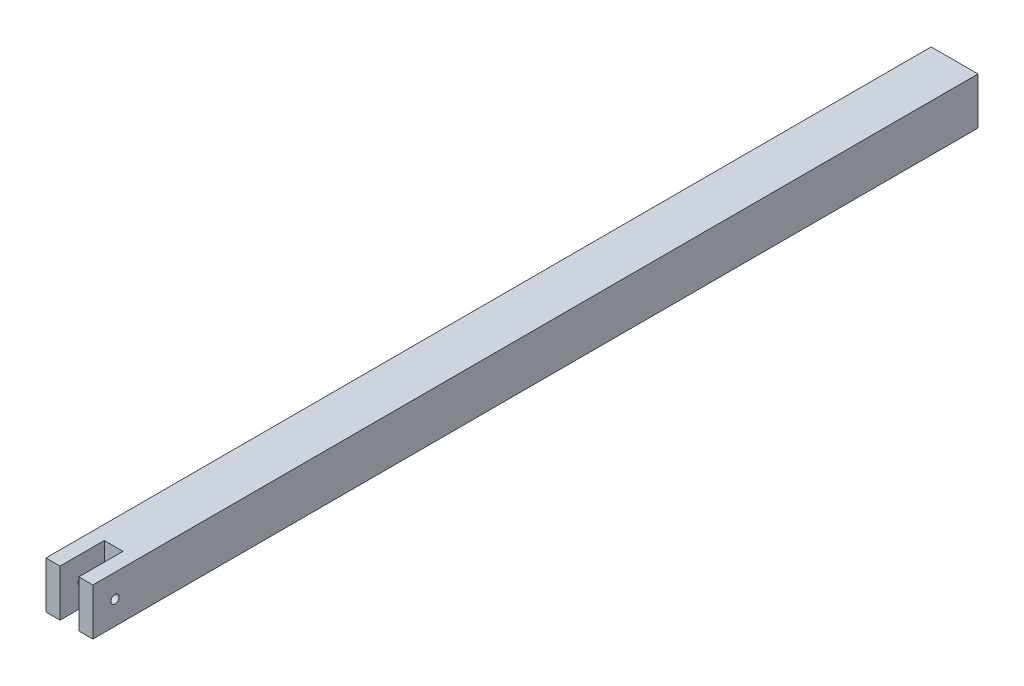
ISO-10303-21;
HEADER;
FILE_DESCRIPTION(('STEP AP214'),'2;1');
FILE_NAME('part.step','',(''),(''),'','','');
FILE_SCHEMA(('AUTOMOTIVE_DESIGN { 1 0 10303 214 1 1 1 1 }'));
ENDSEC;
DATA;
#1=APPLICATION_CONTEXT('core data for automotive mechanical design processes');
#2=APPLICATION_PROTOCOL_DEFINITION('international standard','automotive_design',2000,#1);
#3=PRODUCT_CONTEXT('',#1,'mechanical');
#4=PRODUCT('Part','Part','',(#3));
#5=PRODUCT_RELATED_PRODUCT_CATEGORY('part','',(#4));
#6=PRODUCT_DEFINITION_FORMATION('','',#4);
#7=PRODUCT_DEFINITION_CONTEXT('part definition',#1,'design');
#8=PRODUCT_DEFINITION('design','',#6,#7);
#9=PRODUCT_DEFINITION_SHAPE('','',#8);
#10=(LENGTH_UNIT() NAMED_UNIT(*) SI_UNIT(.MILLI.,.METRE.));
#11=(NAMED_UNIT(*) PLANE_ANGLE_UNIT() SI_UNIT($,.RADIAN.));
#12=(NAMED_UNIT(*) SI_UNIT($,.STERADIAN.) SOLID_ANGLE_UNIT());
#13=UNCERTAINTY_MEASURE_WITH_UNIT(LENGTH_MEASURE(1.E-05),#10,'distance_accuracy_value','');
#14=(GEOMETRIC_REPRESENTATION_CONTEXT(3) GLOBAL_UNCERTAINTY_ASSIGNED_CONTEXT((#13)) GLOBAL_UNIT_ASSIGNED_CONTEXT((#10,
#11,#12)) REPRESENTATION_CONTEXT('',''));
#15=CARTESIAN_POINT('',(0.,0.,0.));
#16=DIRECTION('',(0.,0.,1.));
#17=DIRECTION('',(1.,0.,0.));
#18=AXIS2_PLACEMENT_3D('',#15,#16,#17);
#19=CARTESIAN_POINT('',(0.,0.,1700.));
#20=DIRECTION('',(0.,0.,-1.));
#21=DIRECTION('',(-1.,0.,0.));
#22=AXIS2_PLACEMENT_3D('',#19,#20,#21);
#23=PLANE('',#22);
#24=DIRECTION('',(1.,0.,0.));
#25=VECTOR('',#24,1.);
#26=CARTESIAN_POINT('',(0.,0.,1700.));
#27=LINE('',#26,#25);
#28=CARTESIAN_POINT('',(0.,0.,1700.));
#29=VERTEX_POINT('',#28);
#30=CARTESIAN_POINT('',(27.,0.,1700.));
#31=VERTEX_POINT('',#30);
#32=EDGE_CURVE('E86',#29,#31,#27,.T.);
#33=ORIENTED_EDGE('',*,*,#32,.T.);
#34=DIRECTION('',(0.,-1.,0.));
#35=VECTOR('',#34,1.);
#36=CARTESIAN_POINT('',(27.,90.,1700.));
#37=LINE('',#36,#35);
#38=CARTESIAN_POINT('',(27.,90.,1700.));
#39=VERTEX_POINT('',#38);
#40=EDGE_CURVE('E137',#39,#31,#37,.T.);
#41=ORIENTED_EDGE('',*,*,#40,.F.);
#42=DIRECTION('',(-1.,0.,0.));
#43=VECTOR('',#42,1.);
#44=CARTESIAN_POINT('',(0.,90.,1700.));
#45=LINE('',#44,#43);
#46=CARTESIAN_POINT('',(0.,90.,1700.));
#47=VERTEX_POINT('',#46);
#48=EDGE_CURVE('E57',#39,#47,#45,.T.);
#49=ORIENTED_EDGE('',*,*,#48,.T.);
#50=DIRECTION('',(0.,-1.,0.));
#51=VECTOR('',#50,1.);
#52=CARTESIAN_POINT('',(0.,0.,1700.));
#53=LINE('',#52,#51);
#54=EDGE_CURVE('E143',#47,#29,#53,.T.);
#55=ORIENTED_EDGE('',*,*,#54,.T.);
#56=EDGE_LOOP('',(#33,#41,#49,#55));
#57=FACE_BOUND('',#56,.T.);
#58=ADVANCED_FACE('F32',(#57),#23,.F.);
#59=CARTESIAN_POINT('',(0.,0.,1700.));
#60=DIRECTION('',(1.,0.,0.));
#61=DIRECTION('',(0.,0.,-1.));
#62=AXIS2_PLACEMENT_3D('',#59,#60,#61);
#63=PLANE('',#62);
#64=CARTESIAN_POINT('',(0.,45.,1657.5));
#65=DIRECTION('',(1.,0.,0.));
#66=DIRECTION('',(0.,0.,-1.));
#67=AXIS2_PLACEMENT_3D('',#64,#65,#66);
#68=CIRCLE('',#67,7.99999999999998);
#69=CARTESIAN_POINT('',(0.,45.,1649.5));
#70=VERTEX_POINT('',#69);
#71=EDGE_CURVE('E262',#70,#70,#68,.T.);
#72=ORIENTED_EDGE('',*,*,#71,.T.);
#73=EDGE_LOOP('',(#72));
#74=FACE_BOUND('',#73,.T.);
#75=DIRECTION('',(0.,-1.,0.));
#76=VECTOR('',#75,1.);
#77=CARTESIAN_POINT('',(0.,0.,0.));
#78=LINE('',#77,#76);
#79=CARTESIAN_POINT('',(0.,90.,0.));
#80=VERTEX_POINT('',#79);
#81=CARTESIAN_POINT('',(0.,0.,0.));
#82=VERTEX_POINT('',#81);
#83=EDGE_CURVE('E139',#80,#82,#78,.T.);
#84=ORIENTED_EDGE('',*,*,#83,.T.);
#85=DIRECTION('',(0.,0.,-1.));
#86=VECTOR('',#85,1.);
#87=CARTESIAN_POINT('',(0.,0.,1700.));
#88=LINE('',#87,#86);
#89=EDGE_CURVE('E11',#29,#82,#88,.T.);
#90=ORIENTED_EDGE('',*,*,#89,.F.);
#91=ORIENTED_EDGE('',*,*,#54,.F.);
#92=DIRECTION('',(0.,0.,-1.));
#93=VECTOR('',#92,1.);
#94=CARTESIAN_POINT('',(0.,90.,1700.));
#95=LINE('',#94,#93);
#96=EDGE_CURVE('E152',#47,#80,#95,.T.);
#97=ORIENTED_EDGE('',*,*,#96,.T.);
#98=EDGE_LOOP('',(#84,#90,#91,#97));
#99=FACE_BOUND('',#98,.T.);
#100=ADVANCED_FACE('F34',(#74,#99),#63,.F.);
#101=CARTESIAN_POINT('',(0.,0.,1700.));
#102=DIRECTION('',(0.,1.,0.));
#103=DIRECTION('',(0.,0.,1.));
#104=AXIS2_PLACEMENT_3D('',#101,#102,#103);
#105=PLANE('',#104);
#106=DIRECTION('',(1.,0.,0.));
#107=VECTOR('',#106,1.);
#108=CARTESIAN_POINT('',(27.,0.,1615.));
#109=LINE('',#108,#107);
#110=CARTESIAN_POINT('',(27.,0.,1615.));
#111=VERTEX_POINT('',#110);
#112=CARTESIAN_POINT('',(63.,0.,1615.));
#113=VERTEX_POINT('',#112);
#114=EDGE_CURVE('E128',#111,#113,#109,.T.);
#115=ORIENTED_EDGE('',*,*,#114,.F.);
#116=DIRECTION('',(0.,0.,-1.));
#117=VECTOR('',#116,1.);
#118=CARTESIAN_POINT('',(27.,0.,1700.));
#119=LINE('',#118,#117);
#120=EDGE_CURVE('E113',#31,#111,#119,.T.);
#121=ORIENTED_EDGE('',*,*,#120,.F.);
#122=ORIENTED_EDGE('',*,*,#32,.F.);
#123=ORIENTED_EDGE('',*,*,#89,.T.);
#124=DIRECTION('',(1.,0.,0.));
#125=VECTOR('',#124,1.);
#126=CARTESIAN_POINT('',(0.,0.,0.));
#127=LINE('',#126,#125);
#128=CARTESIAN_POINT('',(90.,0.,0.));
#129=VERTEX_POINT('',#128);
#130=EDGE_CURVE('E155',#82,#129,#127,.T.);
#131=ORIENTED_EDGE('',*,*,#130,.T.);
#132=DIRECTION('',(0.,0.,-1.));
#133=VECTOR('',#132,1.);
#134=CARTESIAN_POINT('',(90.,0.,1700.));
#135=LINE('',#134,#133);
#136=CARTESIAN_POINT('',(90.,0.,1700.));
#137=VERTEX_POINT('',#136);
#138=EDGE_CURVE('E41',#137,#129,#135,.T.);
#139=ORIENTED_EDGE('',*,*,#138,.F.);
#140=CARTESIAN_POINT('',(63.,0.,1700.));
#141=VERTEX_POINT('',#140);
#142=EDGE_CURVE('E145',#141,#137,#27,.T.);
#143=ORIENTED_EDGE('',*,*,#142,.F.);
#144=DIRECTION('',(0.,0.,1.));
#145=VECTOR('',#144,1.);
#146=CARTESIAN_POINT('',(63.,0.,1700.));
#147=LINE('',#146,#145);
#148=EDGE_CURVE('E48',#113,#141,#147,.T.);
#149=ORIENTED_EDGE('',*,*,#148,.F.);
#150=EDGE_LOOP('',(#115,#121,#122,#123,#131,#139,#143,#149));
#151=FACE_BOUND('',#150,.T.);
#152=ADVANCED_FACE('F177',(#151),#105,.F.);
#153=CARTESIAN_POINT('',(90.,0.,1700.));
#154=DIRECTION('',(-1.,0.,0.));
#155=DIRECTION('',(0.,0.,1.));
#156=AXIS2_PLACEMENT_3D('',#153,#154,#155);
#157=PLANE('',#156);
#158=CARTESIAN_POINT('',(90.,45.,1657.5));
#159=DIRECTION('',(1.,0.,0.));
#160=DIRECTION('',(0.,0.,-1.));
#161=AXIS2_PLACEMENT_3D('',#158,#159,#160);
#162=CIRCLE('',#161,7.99999999999998);
#163=CARTESIAN_POINT('',(90.,45.,1649.5));
#164=VERTEX_POINT('',#163);
#165=EDGE_CURVE('E266',#164,#164,#162,.T.);
#166=ORIENTED_EDGE('',*,*,#165,.F.);
#167=EDGE_LOOP('',(#166));
#168=FACE_BOUND('',#167,.T.);
#169=DIRECTION('',(0.,1.,0.));
#170=VECTOR('',#169,1.);
#171=CARTESIAN_POINT('',(90.,0.,0.));
#172=LINE('',#171,#170);
#173=CARTESIAN_POINT('',(90.,90.,0.));
#174=VERTEX_POINT('',#173);
#175=EDGE_CURVE('E157',#129,#174,#172,.T.);
#176=ORIENTED_EDGE('',*,*,#175,.T.);
#177=DIRECTION('',(0.,0.,-1.));
#178=VECTOR('',#177,1.);
#179=CARTESIAN_POINT('',(90.,90.,1700.));
#180=LINE('',#179,#178);
#181=CARTESIAN_POINT('',(90.,90.,1700.));
#182=VERTEX_POINT('',#181);
#183=EDGE_CURVE('E161',#182,#174,#180,.T.);
#184=ORIENTED_EDGE('',*,*,#183,.F.);
#185=DIRECTION('',(0.,1.,0.));
#186=VECTOR('',#185,1.);
#187=CARTESIAN_POINT('',(90.,0.,1700.));
#188=LINE('',#187,#186);
#189=EDGE_CURVE('E147',#137,#182,#188,.T.);
#190=ORIENTED_EDGE('',*,*,#189,.F.);
#191=ORIENTED_EDGE('',*,*,#138,.T.);
#192=EDGE_LOOP('',(#176,#184,#190,#191));
#193=FACE_BOUND('',#192,.T.);
#194=ADVANCED_FACE('F168',(#168,#193),#157,.F.);
#195=CARTESIAN_POINT('',(0.,90.,1700.));
#196=DIRECTION('',(0.,-1.,0.));
#197=DIRECTION('',(0.,0.,-1.));
#198=AXIS2_PLACEMENT_3D('',#195,#196,#197);
#199=PLANE('',#198);
#200=ORIENTED_EDGE('',*,*,#48,.F.);
#201=DIRECTION('',(0.,0.,-1.));
#202=VECTOR('',#201,1.);
#203=CARTESIAN_POINT('',(27.,90.,1700.));
#204=LINE('',#203,#202);
#205=CARTESIAN_POINT('',(27.,90.,1615.));
#206=VERTEX_POINT('',#205);
#207=EDGE_CURVE('E112',#39,#206,#204,.T.);
#208=ORIENTED_EDGE('',*,*,#207,.T.);
#209=DIRECTION('',(1.,0.,0.));
#210=VECTOR('',#209,1.);
#211=CARTESIAN_POINT('',(27.,90.,1615.));
#212=LINE('',#211,#210);
#213=CARTESIAN_POINT('',(63.,90.,1615.));
#214=VERTEX_POINT('',#213);
#215=EDGE_CURVE('E121',#206,#214,#212,.T.);
#216=ORIENTED_EDGE('',*,*,#215,.T.);
#217=DIRECTION('',(0.,0.,1.));
#218=VECTOR('',#217,1.);
#219=CARTESIAN_POINT('',(63.,90.,1700.));
#220=LINE('',#219,#218);
#221=CARTESIAN_POINT('',(63.,90.,1700.));
#222=VERTEX_POINT('',#221);
#223=EDGE_CURVE('E118',#214,#222,#220,.T.);
#224=ORIENTED_EDGE('',*,*,#223,.T.);
#225=EDGE_CURVE('E149',#182,#222,#45,.T.);
#226=ORIENTED_EDGE('',*,*,#225,.F.);
#227=ORIENTED_EDGE('',*,*,#183,.T.);
#228=DIRECTION('',(-1.,0.,0.));
#229=VECTOR('',#228,1.);
#230=CARTESIAN_POINT('',(0.,90.,0.));
#231=LINE('',#230,#229);
#232=EDGE_CURVE('E79',#174,#80,#231,.T.);
#233=ORIENTED_EDGE('',*,*,#232,.T.);
#234=ORIENTED_EDGE('',*,*,#96,.F.);
#235=EDGE_LOOP('',(#200,#208,#216,#224,#226,#227,#233,#234));
#236=FACE_BOUND('',#235,.T.);
#237=ADVANCED_FACE('F126',(#236),#199,.F.);
#238=ORIENTED_EDGE('',*,*,#225,.T.);
#239=DIRECTION('',(0.,-1.,0.));
#240=VECTOR('',#239,1.);
#241=CARTESIAN_POINT('',(63.,90.,1700.));
#242=LINE('',#241,#240);
#243=EDGE_CURVE('E140',#222,#141,#242,.T.);
#244=ORIENTED_EDGE('',*,*,#243,.T.);
#245=ORIENTED_EDGE('',*,*,#142,.T.);
#246=ORIENTED_EDGE('',*,*,#189,.T.);
#247=EDGE_LOOP('',(#238,#244,#245,#246));
#248=FACE_BOUND('',#247,.T.);
#249=ADVANCED_FACE('F179',(#248),#23,.F.);
#250=CARTESIAN_POINT('',(0.,0.,0.));
#251=DIRECTION('',(0.,0.,-1.));
#252=DIRECTION('',(-1.,0.,0.));
#253=AXIS2_PLACEMENT_3D('',#250,#251,#252);
#254=PLANE('',#253);
#255=ORIENTED_EDGE('',*,*,#83,.F.);
#256=ORIENTED_EDGE('',*,*,#232,.F.);
#257=ORIENTED_EDGE('',*,*,#175,.F.);
#258=ORIENTED_EDGE('',*,*,#130,.F.);
#259=EDGE_LOOP('',(#255,#256,#257,#258));
#260=FACE_BOUND('',#259,.T.);
#261=ADVANCED_FACE('F173',(#260),#254,.T.);
#262=CARTESIAN_POINT('',(27.,90.,1700.));
#263=DIRECTION('',(-1.,0.,0.));
#264=DIRECTION('',(0.,0.,1.));
#265=AXIS2_PLACEMENT_3D('',#262,#263,#264);
#266=PLANE('',#265);
#267=CARTESIAN_POINT('',(27.,45.,1657.5));
#268=DIRECTION('',(-1.,0.,0.));
#269=DIRECTION('',(0.,0.,1.));
#270=AXIS2_PLACEMENT_3D('',#267,#268,#269);
#271=CIRCLE('',#270,7.99999999999998);
#272=CARTESIAN_POINT('',(27.,45.,1649.5));
#273=VERTEX_POINT('',#272);
#274=EDGE_CURVE('E131',#273,#273,#271,.T.);
#275=ORIENTED_EDGE('',*,*,#274,.T.);
#276=EDGE_LOOP('',(#275));
#277=FACE_BOUND('',#276,.T.);
#278=ORIENTED_EDGE('',*,*,#120,.T.);
#279=DIRECTION('',(0.,-1.,0.));
#280=VECTOR('',#279,1.);
#281=CARTESIAN_POINT('',(27.,90.,1615.));
#282=LINE('',#281,#280);
#283=EDGE_CURVE('E108',#206,#111,#282,.T.);
#284=ORIENTED_EDGE('',*,*,#283,.F.);
#285=ORIENTED_EDGE('',*,*,#207,.F.);
#286=ORIENTED_EDGE('',*,*,#40,.T.);
#287=EDGE_LOOP('',(#278,#284,#285,#286));
#288=FACE_BOUND('',#287,.T.);
#289=ADVANCED_FACE('F110',(#277,#288),#266,.F.);
#290=CARTESIAN_POINT('',(63.,90.,1700.));
#291=DIRECTION('',(1.,0.,0.));
#292=DIRECTION('',(0.,0.,-1.));
#293=AXIS2_PLACEMENT_3D('',#290,#291,#292);
#294=PLANE('',#293);
#295=CARTESIAN_POINT('',(63.,45.,1657.5));
#296=DIRECTION('',(1.,0.,0.));
#297=DIRECTION('',(0.,0.,-1.));
#298=AXIS2_PLACEMENT_3D('',#295,#296,#297);
#299=CIRCLE('',#298,7.99999999999998);
#300=CARTESIAN_POINT('',(63.,45.,1649.5));
#301=VERTEX_POINT('',#300);
#302=EDGE_CURVE('E36',#301,#301,#299,.T.);
#303=ORIENTED_EDGE('',*,*,#302,.T.);
#304=EDGE_LOOP('',(#303));
#305=FACE_BOUND('',#304,.T.);
#306=ORIENTED_EDGE('',*,*,#148,.T.);
#307=ORIENTED_EDGE('',*,*,#243,.F.);
#308=ORIENTED_EDGE('',*,*,#223,.F.);
#309=DIRECTION('',(0.,-1.,0.));
#310=VECTOR('',#309,1.);
#311=CARTESIAN_POINT('',(63.,90.,1615.));
#312=LINE('',#311,#310);
#313=EDGE_CURVE('E117',#214,#113,#312,.T.);
#314=ORIENTED_EDGE('',*,*,#313,.T.);
#315=EDGE_LOOP('',(#306,#307,#308,#314));
#316=FACE_BOUND('',#315,.T.);
#317=ADVANCED_FACE('F181',(#305,#316),#294,.F.);
#318=CARTESIAN_POINT('',(27.,90.,1615.));
#319=DIRECTION('',(0.,0.,-1.));
#320=DIRECTION('',(-1.,0.,0.));
#321=AXIS2_PLACEMENT_3D('',#318,#319,#320);
#322=PLANE('',#321);
#323=ORIENTED_EDGE('',*,*,#114,.T.);
#324=ORIENTED_EDGE('',*,*,#313,.F.);
#325=ORIENTED_EDGE('',*,*,#215,.F.);
#326=ORIENTED_EDGE('',*,*,#283,.T.);
#327=EDGE_LOOP('',(#323,#324,#325,#326));
#328=FACE_BOUND('',#327,.T.);
#329=ADVANCED_FACE('F122',(#328),#322,.F.);
#330=CARTESIAN_POINT('',(0.,45.,1657.5));
#331=DIRECTION('',(1.,0.,0.));
#332=DIRECTION('',(0.,0.,-1.));
#333=AXIS2_PLACEMENT_3D('',#330,#331,#332);
#334=CYLINDRICAL_SURFACE('',#333,7.99999999999998);
#335=CARTESIAN_POINT('',(90.,45.,1649.5));
#336=CARTESIAN_POINT('',(89.71875,45.,1649.5));
#337=CARTESIAN_POINT('',(89.4375,45.,1649.5));
#338=CARTESIAN_POINT('',(88.875,45.,1649.5));
#339=CARTESIAN_POINT('',(88.59375,45.,1649.5));
#340=CARTESIAN_POINT('',(88.03125,45.,1649.5));
#341=CARTESIAN_POINT('',(87.75,45.,1649.5));
#342=CARTESIAN_POINT('',(87.1875,45.,1649.5));
#343=CARTESIAN_POINT('',(86.90625,45.,1649.5));
#344=CARTESIAN_POINT('',(86.34375,45.,1649.5));
#345=CARTESIAN_POINT('',(86.0625,45.,1649.5));
#346=CARTESIAN_POINT('',(85.5,45.,1649.5));
#347=CARTESIAN_POINT('',(85.21875,45.,1649.5));
#348=CARTESIAN_POINT('',(84.65625,45.,1649.5));
#349=CARTESIAN_POINT('',(84.375,45.,1649.5));
#350=CARTESIAN_POINT('',(83.8125,45.,1649.5));
#351=CARTESIAN_POINT('',(83.53125,45.,1649.5));
#352=CARTESIAN_POINT('',(82.96875,45.,1649.5));
#353=CARTESIAN_POINT('',(82.6875,45.,1649.5));
#354=CARTESIAN_POINT('',(82.125,45.,1649.5));
#355=CARTESIAN_POINT('',(81.84375,45.,1649.5));
#356=CARTESIAN_POINT('',(81.28125,45.,1649.5));
#357=CARTESIAN_POINT('',(81.,45.,1649.5));
#358=CARTESIAN_POINT('',(80.4375,45.,1649.5));
#359=CARTESIAN_POINT('',(80.15625,45.,1649.5));
#360=CARTESIAN_POINT('',(79.59375,45.,1649.5));
#361=CARTESIAN_POINT('',(79.3125,45.,1649.5));
#362=CARTESIAN_POINT('',(78.75,45.,1649.5));
#363=CARTESIAN_POINT('',(78.46875,45.,1649.5));
#364=CARTESIAN_POINT('',(77.90625,45.,1649.5));
#365=CARTESIAN_POINT('',(77.625,45.,1649.5));
#366=CARTESIAN_POINT('',(77.0625,45.,1649.5));
#367=CARTESIAN_POINT('',(76.78125,45.,1649.5));
#368=CARTESIAN_POINT('',(76.21875,45.,1649.5));
#369=CARTESIAN_POINT('',(75.9375,45.,1649.5));
#370=CARTESIAN_POINT('',(75.375,45.,1649.5));
#371=CARTESIAN_POINT('',(75.09375,45.,1649.5));
#372=CARTESIAN_POINT('',(74.53125,45.,1649.5));
#373=CARTESIAN_POINT('',(74.25,45.,1649.5));
#374=CARTESIAN_POINT('',(73.6875,45.,1649.5));
#375=CARTESIAN_POINT('',(73.40625,45.,1649.5));
#376=CARTESIAN_POINT('',(72.84375,45.,1649.5));
#377=CARTESIAN_POINT('',(72.5625,45.,1649.5));
#378=CARTESIAN_POINT('',(72.,45.,1649.5));
#379=CARTESIAN_POINT('',(71.71875,45.,1649.5));
#380=CARTESIAN_POINT('',(71.15625,45.,1649.5));
#381=CARTESIAN_POINT('',(70.875,45.,1649.5));
#382=CARTESIAN_POINT('',(70.3125,45.,1649.5));
#383=CARTESIAN_POINT('',(70.03125,45.,1649.5));
#384=CARTESIAN_POINT('',(69.46875,45.,1649.5));
#385=CARTESIAN_POINT('',(69.1875,45.,1649.5));
#386=CARTESIAN_POINT('',(68.625,45.,1649.5));
#387=CARTESIAN_POINT('',(68.34375,45.,1649.5));
#388=CARTESIAN_POINT('',(67.78125,45.,1649.5));
#389=CARTESIAN_POINT('',(67.5,45.,1649.5));
#390=CARTESIAN_POINT('',(66.9375,45.,1649.5));
#391=CARTESIAN_POINT('',(66.65625,45.,1649.5));
#392=CARTESIAN_POINT('',(66.09375,45.,1649.5));
#393=CARTESIAN_POINT('',(65.8125,45.,1649.5));
#394=CARTESIAN_POINT('',(65.25,45.,1649.5));
#395=CARTESIAN_POINT('',(64.96875,45.,1649.5));
#396=CARTESIAN_POINT('',(64.40625,45.,1649.5));
#397=CARTESIAN_POINT('',(64.125,45.,1649.5));
#398=CARTESIAN_POINT('',(63.5625,45.,1649.5));
#399=CARTESIAN_POINT('',(63.28125,45.,1649.5));
#400=CARTESIAN_POINT('',(63.,45.,1649.5));
#401=B_SPLINE_CURVE_WITH_KNOTS('',3,(#335,#336,#337,#338,#339,#340,#341,#342,#343,#344,#345,
#346,#347,#348,#349,#350,#351,#352,#353,#354,#355,#356,#357,#358,#359,#360,#361,#362,#363,#364,
#365,#366,#367,#368,#369,#370,#371,#372,#373,#374,#375,#376,#377,#378,#379,#380,#381,#382,#383,
#384,#385,#386,#387,#388,#389,#390,#391,#392,#393,#394,#395,#396,#397,#398,#399,#400),
.UNSPECIFIED.,.F.,.F.,(4,2,2,2,2,2,2,2,2,2,2,2,2,2,2,2,2,2,2,2,2,2,2,2,2,2,2,2,2,2,2,2,4),(0.,
0.843750000000004,1.68749999999999,2.53125,3.375,4.21874999999999,5.0625,5.90625,
6.75000000000001,7.59375,8.4375,9.28124999999999,10.125,10.96875,11.8125,12.65625,13.5,14.34375,
15.1875,16.03125,16.875,17.71875,18.5625,19.40625,20.25,21.09375,21.9375,22.78125,23.625,
24.46875,25.3125,26.15625,27.),.UNSPECIFIED.);
#402=EDGE_CURVE('BSEAM189',#164,#301,#401,.T.);
#403=ORIENTED_EDGE('',*,*,#165,.T.);
#404=ORIENTED_EDGE('',*,*,#302,.F.);
#405=ORIENTED_EDGE('',*,*,#402,.T.);
#406=ORIENTED_EDGE('',*,*,#402,.F.);
#407=EDGE_LOOP('',(#403,#405,#404,#406));
#408=FACE_BOUND('',#407,.T.);
#409=ADVANCED_FACE('F189',(#408),#334,.F.);
#410=CARTESIAN_POINT('',(0.,45.,1649.5));
#411=CARTESIAN_POINT('',(0.28125,45.,1649.5));
#412=CARTESIAN_POINT('',(0.5625,45.,1649.5));
#413=CARTESIAN_POINT('',(1.125,45.,1649.5));
#414=CARTESIAN_POINT('',(1.40625,45.,1649.5));
#415=CARTESIAN_POINT('',(1.96875,45.,1649.5));
#416=CARTESIAN_POINT('',(2.25,45.,1649.5));
#417=CARTESIAN_POINT('',(2.8125,45.,1649.5));
#418=CARTESIAN_POINT('',(3.09375,45.,1649.5));
#419=CARTESIAN_POINT('',(3.65625,45.,1649.5));
#420=CARTESIAN_POINT('',(3.9375,45.,1649.5));
#421=CARTESIAN_POINT('',(4.5,45.,1649.5));
#422=CARTESIAN_POINT('',(4.78125,45.,1649.5));
#423=CARTESIAN_POINT('',(5.34375,45.,1649.5));
#424=CARTESIAN_POINT('',(5.625,45.,1649.5));
#425=CARTESIAN_POINT('',(6.1875,45.,1649.5));
#426=CARTESIAN_POINT('',(6.46875,45.,1649.5));
#427=CARTESIAN_POINT('',(7.03125,45.,1649.5));
#428=CARTESIAN_POINT('',(7.3125,45.,1649.5));
#429=CARTESIAN_POINT('',(7.875,45.,1649.5));
#430=CARTESIAN_POINT('',(8.15625,45.,1649.5));
#431=CARTESIAN_POINT('',(8.71875,45.,1649.5));
#432=CARTESIAN_POINT('',(9.,45.,1649.5));
#433=CARTESIAN_POINT('',(9.5625,45.,1649.5));
#434=CARTESIAN_POINT('',(9.84375,45.,1649.5));
#435=CARTESIAN_POINT('',(10.40625,45.,1649.5));
#436=CARTESIAN_POINT('',(10.6875,45.,1649.5));
#437=CARTESIAN_POINT('',(11.25,45.,1649.5));
#438=CARTESIAN_POINT('',(11.53125,45.,1649.5));
#439=CARTESIAN_POINT('',(12.09375,45.,1649.5));
#440=CARTESIAN_POINT('',(12.375,45.,1649.5));
#441=CARTESIAN_POINT('',(12.9375,45.,1649.5));
#442=CARTESIAN_POINT('',(13.21875,45.,1649.5));
#443=CARTESIAN_POINT('',(13.78125,45.,1649.5));
#444=CARTESIAN_POINT('',(14.0625,45.,1649.5));
#445=CARTESIAN_POINT('',(14.625,45.,1649.5));
#446=CARTESIAN_POINT('',(14.90625,45.,1649.5));
#447=CARTESIAN_POINT('',(15.46875,45.,1649.5));
#448=CARTESIAN_POINT('',(15.75,45.,1649.5));
#449=CARTESIAN_POINT('',(16.3125,45.,1649.5));
#450=CARTESIAN_POINT('',(16.59375,45.,1649.5));
#451=CARTESIAN_POINT('',(17.15625,45.,1649.5));
#452=CARTESIAN_POINT('',(17.4375,45.,1649.5));
#453=CARTESIAN_POINT('',(18.,45.,1649.5));
#454=CARTESIAN_POINT('',(18.28125,45.,1649.5));
#455=CARTESIAN_POINT('',(18.84375,45.,1649.5));
#456=CARTESIAN_POINT('',(19.125,45.,1649.5));
#457=CARTESIAN_POINT('',(19.6875,45.,1649.5));
#458=CARTESIAN_POINT('',(19.96875,45.,1649.5));
#459=CARTESIAN_POINT('',(20.53125,45.,1649.5));
#460=CARTESIAN_POINT('',(20.8125,45.,1649.5));
#461=CARTESIAN_POINT('',(21.375,45.,1649.5));
#462=CARTESIAN_POINT('',(21.65625,45.,1649.5));
#463=CARTESIAN_POINT('',(22.21875,45.,1649.5));
#464=CARTESIAN_POINT('',(22.5,45.,1649.5));
#465=CARTESIAN_POINT('',(23.0625,45.,1649.5));
#466=CARTESIAN_POINT('',(23.34375,45.,1649.5));
#467=CARTESIAN_POINT('',(23.90625,45.,1649.5));
#468=CARTESIAN_POINT('',(24.1875,45.,1649.5));
#469=CARTESIAN_POINT('',(24.75,45.,1649.5));
#470=CARTESIAN_POINT('',(25.03125,45.,1649.5));
#471=CARTESIAN_POINT('',(25.59375,45.,1649.5));
#472=CARTESIAN_POINT('',(25.875,45.,1649.5));
#473=CARTESIAN_POINT('',(26.4375,45.,1649.5));
#474=CARTESIAN_POINT('',(26.71875,45.,1649.5));
#475=CARTESIAN_POINT('',(27.,45.,1649.5));
#476=B_SPLINE_CURVE_WITH_KNOTS('',3,(#410,#411,#412,#413,#414,#415,#416,#417,#418,#419,#420,
#421,#422,#423,#424,#425,#426,#427,#428,#429,#430,#431,#432,#433,#434,#435,#436,#437,#438,#439,
#440,#441,#442,#443,#444,#445,#446,#447,#448,#449,#450,#451,#452,#453,#454,#455,#456,#457,#458,
#459,#460,#461,#462,#463,#464,#465,#466,#467,#468,#469,#470,#471,#472,#473,#474,#475),
.UNSPECIFIED.,.F.,.F.,(4,2,2,2,2,2,2,2,2,2,2,2,2,2,2,2,2,2,2,2,2,2,2,2,2,2,2,2,2,2,2,2,4),(0.,
0.84375,1.6875,2.53125,3.375,4.21875,5.0625,5.90625,6.75,7.59375,8.4375,9.28125,10.125,10.96875,
11.8125,12.65625,13.5,14.34375,15.1875,16.03125,16.875,17.71875,18.5625,19.40625,20.25,21.09375,
21.9375,22.78125,23.625,24.46875,25.3125,26.15625,27.),.UNSPECIFIED.);
#477=EDGE_CURVE('BSEAM247',#70,#273,#476,.T.);
#478=ORIENTED_EDGE('',*,*,#71,.F.);
#479=ORIENTED_EDGE('',*,*,#274,.F.);
#480=ORIENTED_EDGE('',*,*,#477,.T.);
#481=ORIENTED_EDGE('',*,*,#477,.F.);
#482=EDGE_LOOP('',(#478,#480,#479,#481));
#483=FACE_BOUND('',#482,.T.);
#484=ADVANCED_FACE('F247',(#483),#334,.F.);
#485=CLOSED_SHELL('',(#58,#100,#152,#194,#237,#249,#261,#289,#317,#329,#409,#484));
#486=MANIFOLD_SOLID_BREP('B2',#485);
#487=ADVANCED_BREP_SHAPE_REPRESENTATION('',(#18,#486),#14);
#488=SHAPE_DEFINITION_REPRESENTATION(#9,#487);
ENDSEC;
END-ISO-10303-21;
